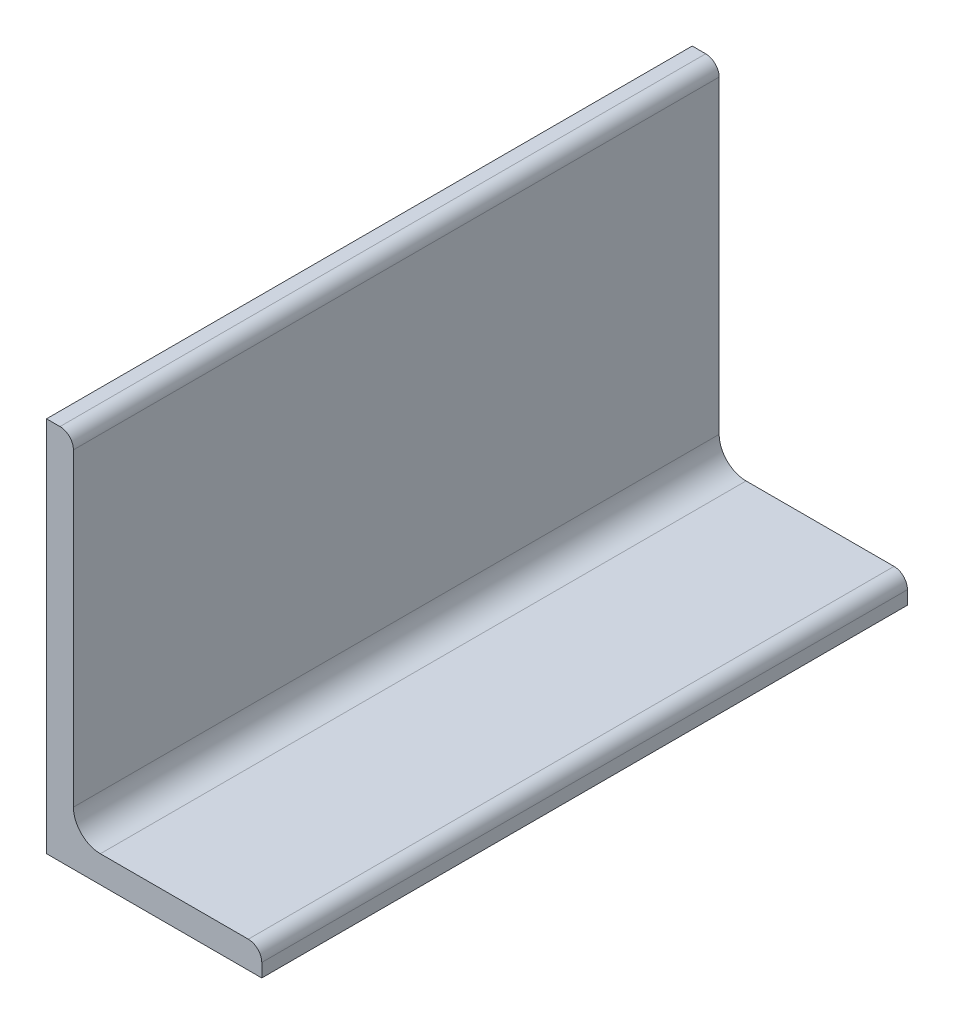
ISO-10303-21;
HEADER;
FILE_DESCRIPTION(('STEP AP214'),'2;1');
FILE_NAME('part.step','',(''),(''),'','','');
FILE_SCHEMA(('AUTOMOTIVE_DESIGN { 1 0 10303 214 1 1 1 1 }'));
ENDSEC;
DATA;
#1=APPLICATION_CONTEXT('core data for automotive mechanical design processes');
#2=APPLICATION_PROTOCOL_DEFINITION('international standard','automotive_design',2000,#1);
#3=PRODUCT_CONTEXT('',#1,'mechanical');
#4=PRODUCT('Part','Part','',(#3));
#5=PRODUCT_RELATED_PRODUCT_CATEGORY('part','',(#4));
#6=PRODUCT_DEFINITION_FORMATION('','',#4);
#7=PRODUCT_DEFINITION_CONTEXT('part definition',#1,'design');
#8=PRODUCT_DEFINITION('design','',#6,#7);
#9=PRODUCT_DEFINITION_SHAPE('','',#8);
#10=(LENGTH_UNIT() NAMED_UNIT(*) SI_UNIT(.MILLI.,.METRE.));
#11=(NAMED_UNIT(*) PLANE_ANGLE_UNIT() SI_UNIT($,.RADIAN.));
#12=(NAMED_UNIT(*) SI_UNIT($,.STERADIAN.) SOLID_ANGLE_UNIT());
#13=UNCERTAINTY_MEASURE_WITH_UNIT(LENGTH_MEASURE(1.E-05),#10,'distance_accuracy_value','');
#14=(GEOMETRIC_REPRESENTATION_CONTEXT(3) GLOBAL_UNCERTAINTY_ASSIGNED_CONTEXT((#13)) GLOBAL_UNIT_ASSIGNED_CONTEXT((#10,
#11,#12)) REPRESENTATION_CONTEXT('',''));
#15=CARTESIAN_POINT('',(0.,0.,0.));
#16=DIRECTION('',(0.,0.,1.));
#17=DIRECTION('',(1.,0.,0.));
#18=AXIS2_PLACEMENT_3D('',#15,#16,#17);
#19=CARTESIAN_POINT('',(0.865045893659089,178.809200992539,304.8));
#20=DIRECTION('',(1.,0.,0.));
#21=DIRECTION('',(0.,0.,-1.));
#22=AXIS2_PLACEMENT_3D('',#19,#20,#21);
#23=PLANE('',#22);
#24=DIRECTION('',(0.,-1.,0.));
#25=VECTOR('',#24,1.);
#26=CARTESIAN_POINT('',(0.865045893659089,178.809200992539,0.));
#27=LINE('',#26,#25);
#28=CARTESIAN_POINT('',(0.865045893659089,178.809200992539,0.));
#29=VERTEX_POINT('',#28);
#30=CARTESIAN_POINT('',(0.865045893659089,1.00920099253867,0.));
#31=VERTEX_POINT('',#30);
#32=EDGE_CURVE('E135',#29,#31,#27,.T.);
#33=ORIENTED_EDGE('',*,*,#32,.T.);
#34=DIRECTION('',(0.,0.,-1.));
#35=VECTOR('',#34,1.);
#36=CARTESIAN_POINT('',(0.865045893659089,1.00920099253867,304.8));
#37=LINE('',#36,#35);
#38=CARTESIAN_POINT('',(0.865045893659089,1.00920099253867,304.8));
#39=VERTEX_POINT('',#38);
#40=EDGE_CURVE('E11',#39,#31,#37,.T.);
#41=ORIENTED_EDGE('',*,*,#40,.F.);
#42=DIRECTION('',(0.,-1.,0.));
#43=VECTOR('',#42,1.);
#44=CARTESIAN_POINT('',(0.865045893659089,178.809200992539,304.8));
#45=LINE('',#44,#43);
#46=CARTESIAN_POINT('',(0.865045893659089,178.809200992539,304.8));
#47=VERTEX_POINT('',#46);
#48=EDGE_CURVE('E151',#47,#39,#45,.T.);
#49=ORIENTED_EDGE('',*,*,#48,.F.);
#50=DIRECTION('',(0.,0.,-1.));
#51=VECTOR('',#50,1.);
#52=CARTESIAN_POINT('',(0.865045893659089,178.809200992539,304.8));
#53=LINE('',#52,#51);
#54=EDGE_CURVE('E131',#47,#29,#53,.T.);
#55=ORIENTED_EDGE('',*,*,#54,.T.);
#56=EDGE_LOOP('',(#33,#41,#49,#55));
#57=FACE_BOUND('',#56,.T.);
#58=ADVANCED_FACE('F33',(#57),#23,.F.);
#59=CARTESIAN_POINT('',(0.865045893659089,1.00920099253867,304.8));
#60=DIRECTION('',(0.,1.,0.));
#61=DIRECTION('',(0.,0.,1.));
#62=AXIS2_PLACEMENT_3D('',#59,#60,#61);
#63=PLANE('',#62);
#64=DIRECTION('',(1.,0.,0.));
#65=VECTOR('',#64,1.);
#66=CARTESIAN_POINT('',(0.865045893659089,1.00920099253867,0.));
#67=LINE('',#66,#65);
#68=CARTESIAN_POINT('',(102.465045893659,1.00920099253867,0.));
#69=VERTEX_POINT('',#68);
#70=EDGE_CURVE('E138',#31,#69,#67,.T.);
#71=ORIENTED_EDGE('',*,*,#70,.T.);
#72=DIRECTION('',(0.,0.,-1.));
#73=VECTOR('',#72,1.);
#74=CARTESIAN_POINT('',(102.465045893659,1.00920099253867,304.8));
#75=LINE('',#74,#73);
#76=CARTESIAN_POINT('',(102.465045893659,1.00920099253867,304.8));
#77=VERTEX_POINT('',#76);
#78=EDGE_CURVE('E41',#77,#69,#75,.T.);
#79=ORIENTED_EDGE('',*,*,#78,.F.);
#80=DIRECTION('',(1.,0.,0.));
#81=VECTOR('',#80,1.);
#82=CARTESIAN_POINT('',(0.865045893659089,1.00920099253867,304.8));
#83=LINE('',#82,#81);
#84=EDGE_CURVE('E95',#39,#77,#83,.T.);
#85=ORIENTED_EDGE('',*,*,#84,.F.);
#86=ORIENTED_EDGE('',*,*,#40,.T.);
#87=EDGE_LOOP('',(#71,#79,#85,#86));
#88=FACE_BOUND('',#87,.T.);
#89=ADVANCED_FACE('F194',(#88),#63,.F.);
#90=CARTESIAN_POINT('',(102.465045893659,1.00920099253867,304.8));
#91=DIRECTION('',(-1.,0.,0.));
#92=DIRECTION('',(0.,0.,1.));
#93=AXIS2_PLACEMENT_3D('',#90,#91,#92);
#94=PLANE('',#93);
#95=DIRECTION('',(0.,1.,0.));
#96=VECTOR('',#95,1.);
#97=CARTESIAN_POINT('',(102.465045893659,1.00920099253867,0.));
#98=LINE('',#97,#96);
#99=CARTESIAN_POINT('',(102.465045893659,7.35920099253867,0.));
#100=VERTEX_POINT('',#99);
#101=EDGE_CURVE('E140',#69,#100,#98,.T.);
#102=ORIENTED_EDGE('',*,*,#101,.T.);
#103=DIRECTION('',(0.,0.,-1.));
#104=VECTOR('',#103,1.);
#105=CARTESIAN_POINT('',(102.465045893659,7.35920099253867,304.8));
#106=LINE('',#105,#104);
#107=CARTESIAN_POINT('',(102.465045893659,7.35920099253867,304.8));
#108=VERTEX_POINT('',#107);
#109=EDGE_CURVE('E161',#108,#100,#106,.T.);
#110=ORIENTED_EDGE('',*,*,#109,.F.);
#111=DIRECTION('',(0.,1.,0.));
#112=VECTOR('',#111,1.);
#113=CARTESIAN_POINT('',(102.465045893659,1.00920099253867,304.8));
#114=LINE('',#113,#112);
#115=EDGE_CURVE('E169',#77,#108,#114,.T.);
#116=ORIENTED_EDGE('',*,*,#115,.F.);
#117=ORIENTED_EDGE('',*,*,#78,.T.);
#118=EDGE_LOOP('',(#102,#110,#116,#117));
#119=FACE_BOUND('',#118,.T.);
#120=ADVANCED_FACE('F167',(#119),#94,.F.);
#121=CARTESIAN_POINT('',(96.1150458936591,7.35920099253867,304.8));
#122=DIRECTION('',(0.,0.,-1.));
#123=DIRECTION('',(-1.,0.,0.));
#124=AXIS2_PLACEMENT_3D('',#121,#122,#123);
#125=CYLINDRICAL_SURFACE('',#124,6.35000000000001);
#126=CARTESIAN_POINT('',(96.1150458936591,7.35920099253867,0.));
#127=DIRECTION('',(0.,0.,1.));
#128=DIRECTION('',(1.,0.,0.));
#129=AXIS2_PLACEMENT_3D('',#126,#127,#128);
#130=CIRCLE('',#129,6.35000000000001);
#131=CARTESIAN_POINT('',(96.1150458936591,13.7092009925387,0.));
#132=VERTEX_POINT('',#131);
#133=EDGE_CURVE('E142',#100,#132,#130,.T.);
#134=ORIENTED_EDGE('',*,*,#133,.T.);
#135=DIRECTION('',(0.,0.,-1.));
#136=VECTOR('',#135,1.);
#137=CARTESIAN_POINT('',(96.1150458936591,13.7092009925387,304.8));
#138=LINE('',#137,#136);
#139=CARTESIAN_POINT('',(96.1150458936591,13.7092009925387,304.8));
#140=VERTEX_POINT('',#139);
#141=EDGE_CURVE('E158',#140,#132,#138,.T.);
#142=ORIENTED_EDGE('',*,*,#141,.F.);
#143=CARTESIAN_POINT('',(96.1150458936591,7.35920099253867,304.8));
#144=DIRECTION('',(0.,0.,1.));
#145=DIRECTION('',(1.,0.,0.));
#146=AXIS2_PLACEMENT_3D('',#143,#144,#145);
#147=CIRCLE('',#146,6.35000000000001);
#148=EDGE_CURVE('E185',#108,#140,#147,.T.);
#149=ORIENTED_EDGE('',*,*,#148,.F.);
#150=ORIENTED_EDGE('',*,*,#109,.T.);
#151=EDGE_LOOP('',(#134,#142,#149,#150));
#152=FACE_BOUND('',#151,.T.);
#153=ADVANCED_FACE('F178',(#152),#125,.T.);
#154=CARTESIAN_POINT('',(96.1150458936591,13.7092009925387,304.8));
#155=DIRECTION('',(0.,-1.,0.));
#156=DIRECTION('',(0.,0.,-1.));
#157=AXIS2_PLACEMENT_3D('',#154,#155,#156);
#158=PLANE('',#157);
#159=DIRECTION('',(-1.,0.,0.));
#160=VECTOR('',#159,1.);
#161=CARTESIAN_POINT('',(96.1150458936591,13.7092009925387,0.));
#162=LINE('',#161,#160);
#163=CARTESIAN_POINT('',(26.2650458936591,13.7092009925387,0.));
#164=VERTEX_POINT('',#163);
#165=EDGE_CURVE('E144',#132,#164,#162,.T.);
#166=ORIENTED_EDGE('',*,*,#165,.T.);
#167=DIRECTION('',(0.,0.,-1.));
#168=VECTOR('',#167,1.);
#169=CARTESIAN_POINT('',(26.2650458936591,13.7092009925387,304.8));
#170=LINE('',#169,#168);
#171=CARTESIAN_POINT('',(26.2650458936591,13.7092009925387,304.8));
#172=VERTEX_POINT('',#171);
#173=EDGE_CURVE('E155',#172,#164,#170,.T.);
#174=ORIENTED_EDGE('',*,*,#173,.F.);
#175=DIRECTION('',(-1.,0.,0.));
#176=VECTOR('',#175,1.);
#177=CARTESIAN_POINT('',(96.1150458936591,13.7092009925387,304.8));
#178=LINE('',#177,#176);
#179=EDGE_CURVE('E184',#140,#172,#178,.T.);
#180=ORIENTED_EDGE('',*,*,#179,.F.);
#181=ORIENTED_EDGE('',*,*,#141,.T.);
#182=EDGE_LOOP('',(#166,#174,#180,#181));
#183=FACE_BOUND('',#182,.T.);
#184=ADVANCED_FACE('F182',(#183),#158,.F.);
#185=CARTESIAN_POINT('',(26.2650458936591,26.4092009925387,304.8));
#186=DIRECTION('',(0.,0.,-1.));
#187=DIRECTION('',(-1.,0.,0.));
#188=AXIS2_PLACEMENT_3D('',#185,#186,#187);
#189=CYLINDRICAL_SURFACE('',#188,12.7);
#190=CARTESIAN_POINT('',(26.2650458936591,26.4092009925387,0.));
#191=DIRECTION('',(0.,0.,-1.));
#192=DIRECTION('',(1.,0.,0.));
#193=AXIS2_PLACEMENT_3D('',#190,#191,#192);
#194=CIRCLE('',#193,12.7);
#195=CARTESIAN_POINT('',(13.5650458936591,26.4092009925387,0.));
#196=VERTEX_POINT('',#195);
#197=EDGE_CURVE('E146',#164,#196,#194,.T.);
#198=ORIENTED_EDGE('',*,*,#197,.T.);
#199=DIRECTION('',(0.,0.,-1.));
#200=VECTOR('',#199,1.);
#201=CARTESIAN_POINT('',(13.5650458936591,26.4092009925387,304.8));
#202=LINE('',#201,#200);
#203=CARTESIAN_POINT('',(13.5650458936591,26.4092009925387,304.8));
#204=VERTEX_POINT('',#203);
#205=EDGE_CURVE('E126',#204,#196,#202,.T.);
#206=ORIENTED_EDGE('',*,*,#205,.F.);
#207=CARTESIAN_POINT('',(26.2650458936591,26.4092009925387,304.8));
#208=DIRECTION('',(0.,0.,-1.));
#209=DIRECTION('',(1.,0.,0.));
#210=AXIS2_PLACEMENT_3D('',#207,#208,#209);
#211=CIRCLE('',#210,12.7);
#212=EDGE_CURVE('E117',#172,#204,#211,.T.);
#213=ORIENTED_EDGE('',*,*,#212,.F.);
#214=ORIENTED_EDGE('',*,*,#173,.T.);
#215=EDGE_LOOP('',(#198,#206,#213,#214));
#216=FACE_BOUND('',#215,.T.);
#217=ADVANCED_FACE('F206',(#216),#189,.F.);
#218=CARTESIAN_POINT('',(13.5650458936591,26.4092009925387,304.8));
#219=DIRECTION('',(-1.,0.,0.));
#220=DIRECTION('',(0.,0.,1.));
#221=AXIS2_PLACEMENT_3D('',#218,#219,#220);
#222=PLANE('',#221);
#223=DIRECTION('',(0.,1.,0.));
#224=VECTOR('',#223,1.);
#225=CARTESIAN_POINT('',(13.5650458936591,26.4092009925387,0.));
#226=LINE('',#225,#224);
#227=CARTESIAN_POINT('',(13.5650458936591,172.459200992539,0.));
#228=VERTEX_POINT('',#227);
#229=EDGE_CURVE('E125',#196,#228,#226,.T.);
#230=ORIENTED_EDGE('',*,*,#229,.T.);
#231=DIRECTION('',(0.,0.,-1.));
#232=VECTOR('',#231,1.);
#233=CARTESIAN_POINT('',(13.5650458936591,172.459200992539,304.8));
#234=LINE('',#233,#232);
#235=CARTESIAN_POINT('',(13.5650458936591,172.459200992539,304.8));
#236=VERTEX_POINT('',#235);
#237=EDGE_CURVE('E122',#236,#228,#234,.T.);
#238=ORIENTED_EDGE('',*,*,#237,.F.);
#239=DIRECTION('',(0.,1.,0.));
#240=VECTOR('',#239,1.);
#241=CARTESIAN_POINT('',(13.5650458936591,26.4092009925387,304.8));
#242=LINE('',#241,#240);
#243=EDGE_CURVE('E111',#204,#236,#242,.T.);
#244=ORIENTED_EDGE('',*,*,#243,.F.);
#245=ORIENTED_EDGE('',*,*,#205,.T.);
#246=EDGE_LOOP('',(#230,#238,#244,#245));
#247=FACE_BOUND('',#246,.T.);
#248=ADVANCED_FACE('F123',(#247),#222,.F.);
#249=CARTESIAN_POINT('',(7.2150458936591,172.459200992539,304.8));
#250=DIRECTION('',(0.,0.,-1.));
#251=DIRECTION('',(-1.,0.,0.));
#252=AXIS2_PLACEMENT_3D('',#249,#250,#251);
#253=CYLINDRICAL_SURFACE('',#252,6.34999999999999);
#254=CARTESIAN_POINT('',(7.2150458936591,172.459200992539,0.));
#255=DIRECTION('',(0.,0.,1.));
#256=DIRECTION('',(1.,0.,0.));
#257=AXIS2_PLACEMENT_3D('',#254,#255,#256);
#258=CIRCLE('',#257,6.34999999999999);
#259=CARTESIAN_POINT('',(7.21504589365909,178.809200992539,0.));
#260=VERTEX_POINT('',#259);
#261=EDGE_CURVE('E81',#228,#260,#258,.T.);
#262=ORIENTED_EDGE('',*,*,#261,.T.);
#263=DIRECTION('',(0.,0.,-1.));
#264=VECTOR('',#263,1.);
#265=CARTESIAN_POINT('',(7.21504589365909,178.809200992539,304.8));
#266=LINE('',#265,#264);
#267=CARTESIAN_POINT('',(7.21504589365909,178.809200992539,304.8));
#268=VERTEX_POINT('',#267);
#269=EDGE_CURVE('E127',#268,#260,#266,.T.);
#270=ORIENTED_EDGE('',*,*,#269,.F.);
#271=CARTESIAN_POINT('',(7.2150458936591,172.459200992539,304.8));
#272=DIRECTION('',(0.,0.,1.));
#273=DIRECTION('',(1.,0.,0.));
#274=AXIS2_PLACEMENT_3D('',#271,#272,#273);
#275=CIRCLE('',#274,6.34999999999999);
#276=EDGE_CURVE('E115',#236,#268,#275,.T.);
#277=ORIENTED_EDGE('',*,*,#276,.F.);
#278=ORIENTED_EDGE('',*,*,#237,.T.);
#279=EDGE_LOOP('',(#262,#270,#277,#278));
#280=FACE_BOUND('',#279,.T.);
#281=ADVANCED_FACE('F129',(#280),#253,.T.);
#282=CARTESIAN_POINT('',(7.21504589365909,178.809200992539,304.8));
#283=DIRECTION('',(0.,-1.,0.));
#284=DIRECTION('',(0.,0.,-1.));
#285=AXIS2_PLACEMENT_3D('',#282,#283,#284);
#286=PLANE('',#285);
#287=DIRECTION('',(-1.,0.,0.));
#288=VECTOR('',#287,1.);
#289=CARTESIAN_POINT('',(7.21504589365909,178.809200992539,0.));
#290=LINE('',#289,#288);
#291=EDGE_CURVE('E87',#260,#29,#290,.T.);
#292=ORIENTED_EDGE('',*,*,#291,.T.);
#293=ORIENTED_EDGE('',*,*,#54,.F.);
#294=DIRECTION('',(-1.,0.,0.));
#295=VECTOR('',#294,1.);
#296=CARTESIAN_POINT('',(7.21504589365909,178.809200992539,304.8));
#297=LINE('',#296,#295);
#298=EDGE_CURVE('E49',#268,#47,#297,.T.);
#299=ORIENTED_EDGE('',*,*,#298,.F.);
#300=ORIENTED_EDGE('',*,*,#269,.T.);
#301=EDGE_LOOP('',(#292,#293,#299,#300));
#302=FACE_BOUND('',#301,.T.);
#303=ADVANCED_FACE('F214',(#302),#286,.F.);
#304=CARTESIAN_POINT('',(96.1150458936591,7.35920099253867,304.8));
#305=DIRECTION('',(0.,0.,1.));
#306=DIRECTION('',(1.,0.,0.));
#307=AXIS2_PLACEMENT_3D('',#304,#305,#306);
#308=PLANE('',#307);
#309=ORIENTED_EDGE('',*,*,#48,.T.);
#310=ORIENTED_EDGE('',*,*,#84,.T.);
#311=ORIENTED_EDGE('',*,*,#115,.T.);
#312=ORIENTED_EDGE('',*,*,#148,.T.);
#313=ORIENTED_EDGE('',*,*,#179,.T.);
#314=ORIENTED_EDGE('',*,*,#212,.T.);
#315=ORIENTED_EDGE('',*,*,#243,.T.);
#316=ORIENTED_EDGE('',*,*,#276,.T.);
#317=ORIENTED_EDGE('',*,*,#298,.T.);
#318=EDGE_LOOP('',(#309,#310,#311,#312,#313,#314,#315,#316,#317));
#319=FACE_BOUND('',#318,.T.);
#320=ADVANCED_FACE('F113',(#319),#308,.T.);
#321=CARTESIAN_POINT('',(96.1150458936591,7.35920099253867,0.));
#322=DIRECTION('',(0.,0.,1.));
#323=DIRECTION('',(1.,0.,0.));
#324=AXIS2_PLACEMENT_3D('',#321,#322,#323);
#325=PLANE('',#324);
#326=ORIENTED_EDGE('',*,*,#32,.F.);
#327=ORIENTED_EDGE('',*,*,#291,.F.);
#328=ORIENTED_EDGE('',*,*,#261,.F.);
#329=ORIENTED_EDGE('',*,*,#229,.F.);
#330=ORIENTED_EDGE('',*,*,#197,.F.);
#331=ORIENTED_EDGE('',*,*,#165,.F.);
#332=ORIENTED_EDGE('',*,*,#133,.F.);
#333=ORIENTED_EDGE('',*,*,#101,.F.);
#334=ORIENTED_EDGE('',*,*,#70,.F.);
#335=EDGE_LOOP('',(#326,#327,#328,#329,#330,#331,#332,#333,#334));
#336=FACE_BOUND('',#335,.T.);
#337=ADVANCED_FACE('F173',(#336),#325,.F.);
#338=CLOSED_SHELL('',(#58,#89,#120,#153,#184,#217,#248,#281,#303,#320,#337));
#339=MANIFOLD_SOLID_BREP('B2',#338);
#340=ADVANCED_BREP_SHAPE_REPRESENTATION('',(#18,#339),#14);
#341=SHAPE_DEFINITION_REPRESENTATION(#9,#340);
ENDSEC;
END-ISO-10303-21;
